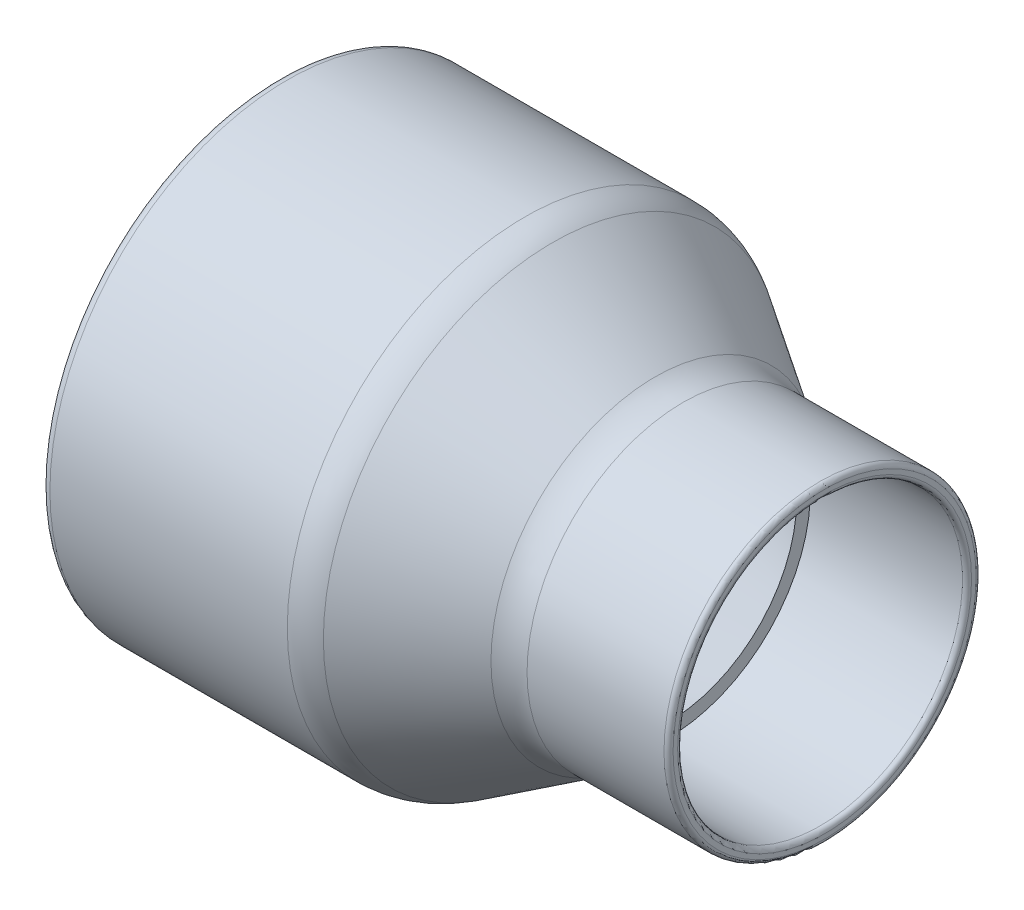
ISO-10303-21;
HEADER;
FILE_DESCRIPTION(('STEP AP214'),'2;1');
FILE_NAME('part.step','',(''),(''),'','','');
FILE_SCHEMA(('AUTOMOTIVE_DESIGN { 1 0 10303 214 1 1 1 1 }'));
ENDSEC;
DATA;
#1=APPLICATION_CONTEXT('core data for automotive mechanical design processes');
#2=APPLICATION_PROTOCOL_DEFINITION('international standard','automotive_design',2000,#1);
#3=PRODUCT_CONTEXT('',#1,'mechanical');
#4=PRODUCT('Part','Part','',(#3));
#5=PRODUCT_RELATED_PRODUCT_CATEGORY('part','',(#4));
#6=PRODUCT_DEFINITION_FORMATION('','',#4);
#7=PRODUCT_DEFINITION_CONTEXT('part definition',#1,'design');
#8=PRODUCT_DEFINITION('design','',#6,#7);
#9=PRODUCT_DEFINITION_SHAPE('','',#8);
#10=(LENGTH_UNIT() NAMED_UNIT(*) SI_UNIT(.MILLI.,.METRE.));
#11=(NAMED_UNIT(*) PLANE_ANGLE_UNIT() SI_UNIT($,.RADIAN.));
#12=(NAMED_UNIT(*) SI_UNIT($,.STERADIAN.) SOLID_ANGLE_UNIT());
#13=UNCERTAINTY_MEASURE_WITH_UNIT(LENGTH_MEASURE(1.E-05),#10,'distance_accuracy_value','');
#14=(GEOMETRIC_REPRESENTATION_CONTEXT(3) GLOBAL_UNCERTAINTY_ASSIGNED_CONTEXT((#13)) GLOBAL_UNIT_ASSIGNED_CONTEXT((#10,
#11,#12)) REPRESENTATION_CONTEXT('',''));
#15=CARTESIAN_POINT('',(0.,0.,0.));
#16=DIRECTION('',(0.,0.,1.));
#17=DIRECTION('',(1.,0.,0.));
#18=AXIS2_PLACEMENT_3D('',#15,#16,#17);
#19=CARTESIAN_POINT('',(30.75,33.9,0.));
#20=DIRECTION('',(-1.,0.,0.));
#21=DIRECTION('',(0.,0.,1.));
#22=AXIS2_PLACEMENT_3D('',#19,#20,#21);
#23=PLANE('',#22);
#24=CARTESIAN_POINT('',(30.75,0.,0.));
#25=DIRECTION('',(-1.,0.,0.));
#26=DIRECTION('',(0.,0.,1.));
#27=AXIS2_PLACEMENT_3D('',#24,#25,#26);
#28=CIRCLE('',#27,37.5);
#29=CARTESIAN_POINT('',(30.75,0.,37.5));
#30=VERTEX_POINT('',#29);
#31=EDGE_CURVE('E10',#30,#30,#28,.T.);
#32=ORIENTED_EDGE('',*,*,#31,.F.);
#33=EDGE_LOOP('',(#32));
#34=FACE_BOUND('',#33,.T.);
#35=CARTESIAN_POINT('',(30.75,0.,0.));
#36=DIRECTION('',(-1.,0.,0.));
#37=DIRECTION('',(0.,0.,1.));
#38=AXIS2_PLACEMENT_3D('',#35,#36,#37);
#39=CIRCLE('',#38,33.9);
#40=CARTESIAN_POINT('',(30.75,0.,33.9));
#41=VERTEX_POINT('',#40);
#42=EDGE_CURVE('E85',#41,#41,#39,.T.);
#43=ORIENTED_EDGE('',*,*,#42,.T.);
#44=EDGE_LOOP('',(#43));
#45=FACE_BOUND('',#44,.T.);
#46=ADVANCED_FACE('F30',(#34,#45),#23,.F.);
#47=CARTESIAN_POINT('',(-72.,0.,0.));
#48=DIRECTION('',(-1.,0.,0.));
#49=DIRECTION('',(0.,0.,1.));
#50=AXIS2_PLACEMENT_3D('',#47,#48,#49);
#51=CYLINDRICAL_SURFACE('',#50,37.5);
#52=CARTESIAN_POINT('',(70.8,0.,0.));
#53=DIRECTION('',(-1.,0.,0.));
#54=DIRECTION('',(0.,0.,1.));
#55=AXIS2_PLACEMENT_3D('',#52,#53,#54);
#56=CIRCLE('',#55,37.5);
#57=CARTESIAN_POINT('',(70.8,0.,37.5));
#58=VERTEX_POINT('',#57);
#59=EDGE_CURVE('E36',#58,#58,#56,.T.);
#60=ORIENTED_EDGE('',*,*,#59,.F.);
#61=EDGE_LOOP('',(#60));
#62=FACE_BOUND('',#61,.T.);
#63=ORIENTED_EDGE('',*,*,#31,.T.);
#64=EDGE_LOOP('',(#63));
#65=FACE_BOUND('',#64,.T.);
#66=ADVANCED_FACE('F176',(#62,#65),#51,.F.);
#67=CARTESIAN_POINT('',(70.8,0.,0.));
#68=DIRECTION('',(-1.,0.,0.));
#69=DIRECTION('',(0.,0.,1.));
#70=AXIS2_PLACEMENT_3D('',#67,#68,#69);
#71=TOROIDAL_SURFACE('',#70,38.7,1.20000000000001);
#72=CARTESIAN_POINT('',(72.,0.,0.));
#73=DIRECTION('',(-1.,0.,0.));
#74=DIRECTION('',(0.,0.,1.));
#75=AXIS2_PLACEMENT_3D('',#72,#73,#74);
#76=CIRCLE('',#75,38.7);
#77=CARTESIAN_POINT('',(72.,0.,38.7));
#78=VERTEX_POINT('',#77);
#79=EDGE_CURVE('E40',#78,#78,#76,.T.);
#80=ORIENTED_EDGE('',*,*,#79,.F.);
#81=EDGE_LOOP('',(#80));
#82=FACE_BOUND('',#81,.T.);
#83=ORIENTED_EDGE('',*,*,#59,.T.);
#84=EDGE_LOOP('',(#83));
#85=FACE_BOUND('',#84,.T.);
#86=ADVANCED_FACE('F171',(#82,#85),#71,.T.);
#87=CARTESIAN_POINT('',(72.,38.7,0.));
#88=DIRECTION('',(-1.,0.,0.));
#89=DIRECTION('',(0.,0.,1.));
#90=AXIS2_PLACEMENT_3D('',#87,#88,#89);
#91=PLANE('',#90);
#92=CARTESIAN_POINT('',(72.,0.,0.));
#93=DIRECTION('',(-1.,0.,0.));
#94=DIRECTION('',(0.,0.,1.));
#95=AXIS2_PLACEMENT_3D('',#92,#93,#94);
#96=CIRCLE('',#95,39.9);
#97=CARTESIAN_POINT('',(72.,0.,39.9));
#98=VERTEX_POINT('',#97);
#99=EDGE_CURVE('E44',#98,#98,#96,.T.);
#100=ORIENTED_EDGE('',*,*,#99,.F.);
#101=EDGE_LOOP('',(#100));
#102=FACE_BOUND('',#101,.T.);
#103=ORIENTED_EDGE('',*,*,#79,.T.);
#104=EDGE_LOOP('',(#103));
#105=FACE_BOUND('',#104,.T.);
#106=ADVANCED_FACE('F165',(#102,#105),#91,.F.);
#107=CARTESIAN_POINT('',(70.8,0.,0.));
#108=DIRECTION('',(-1.,0.,0.));
#109=DIRECTION('',(0.,0.,1.));
#110=AXIS2_PLACEMENT_3D('',#107,#108,#109);
#111=TOROIDAL_SURFACE('',#110,39.9,1.20000000000002);
#112=CARTESIAN_POINT('',(70.8,0.,0.));
#113=DIRECTION('',(-1.,0.,0.));
#114=DIRECTION('',(0.,0.,1.));
#115=AXIS2_PLACEMENT_3D('',#112,#113,#114);
#116=CIRCLE('',#115,41.1);
#117=CARTESIAN_POINT('',(70.8,0.,41.1));
#118=VERTEX_POINT('',#117);
#119=EDGE_CURVE('E49',#118,#118,#116,.T.);
#120=ORIENTED_EDGE('',*,*,#119,.F.);
#121=EDGE_LOOP('',(#120));
#122=FACE_BOUND('',#121,.T.);
#123=ORIENTED_EDGE('',*,*,#99,.T.);
#124=EDGE_LOOP('',(#123));
#125=FACE_BOUND('',#124,.T.);
#126=ADVANCED_FACE('F159',(#122,#125),#111,.T.);
#127=CARTESIAN_POINT('',(-72.,0.,0.));
#128=DIRECTION('',(-1.,0.,0.));
#129=DIRECTION('',(0.,0.,1.));
#130=AXIS2_PLACEMENT_3D('',#127,#128,#129);
#131=CYLINDRICAL_SURFACE('',#130,41.1);
#132=CARTESIAN_POINT('',(34.7418459756254,0.,0.));
#133=DIRECTION('',(-1.,0.,0.));
#134=DIRECTION('',(0.,0.,1.));
#135=AXIS2_PLACEMENT_3D('',#132,#133,#134);
#136=CIRCLE('',#135,41.1);
#137=CARTESIAN_POINT('',(34.7418459756254,0.,41.1));
#138=VERTEX_POINT('',#137);
#139=EDGE_CURVE('E52',#138,#138,#136,.T.);
#140=ORIENTED_EDGE('',*,*,#139,.F.);
#141=EDGE_LOOP('',(#140));
#142=FACE_BOUND('',#141,.T.);
#143=ORIENTED_EDGE('',*,*,#119,.T.);
#144=EDGE_LOOP('',(#143));
#145=FACE_BOUND('',#144,.T.);
#146=ADVANCED_FACE('F153',(#142,#145),#131,.T.);
#147=CARTESIAN_POINT('',(34.7418459756254,0.,0.));
#148=DIRECTION('',(-1.,0.,0.));
#149=DIRECTION('',(0.,0.,1.));
#150=AXIS2_PLACEMENT_3D('',#147,#148,#149);
#151=TOROIDAL_SURFACE('',#150,54.85,13.75);
#152=CARTESIAN_POINT('',(27.3787416467901,0.,0.));
#153=DIRECTION('',(-1.,0.,0.));
#154=DIRECTION('',(0.,0.,1.));
#155=AXIS2_PLACEMENT_3D('',#152,#153,#154);
#156=CIRCLE('',#155,43.2376275187761);
#157=CARTESIAN_POINT('',(27.3787416467901,0.,43.2376275187761));
#158=VERTEX_POINT('',#157);
#159=EDGE_CURVE('E55',#158,#158,#156,.T.);
#160=ORIENTED_EDGE('',*,*,#159,.F.);
#161=EDGE_LOOP('',(#160));
#162=FACE_BOUND('',#161,.T.);
#163=ORIENTED_EDGE('',*,*,#139,.T.);
#164=EDGE_LOOP('',(#163));
#165=FACE_BOUND('',#164,.T.);
#166=ADVANCED_FACE('F147',(#162,#165),#151,.F.);
#167=CARTESIAN_POINT('',(27.3787416467901,0.,0.));
#168=DIRECTION('',(-1.,0.,0.));
#169=DIRECTION('',(0.,0.,1.));
#170=AXIS2_PLACEMENT_3D('',#167,#168,#169);
#171=CONICAL_SURFACE('',#170,43.2376275187761,0.56509789760029);
#172=CARTESIAN_POINT('',(0.371258353209933,0.,0.));
#173=DIRECTION('',(-1.,0.,0.));
#174=DIRECTION('',(0.,0.,1.));
#175=AXIS2_PLACEMENT_3D('',#172,#173,#174);
#176=CIRCLE('',#175,60.3623724812239);
#177=CARTESIAN_POINT('',(0.371258353209933,0.,60.3623724812239));
#178=VERTEX_POINT('',#177);
#179=EDGE_CURVE('E58',#178,#178,#176,.T.);
#180=ORIENTED_EDGE('',*,*,#179,.F.);
#181=EDGE_LOOP('',(#180));
#182=FACE_BOUND('',#181,.T.);
#183=ORIENTED_EDGE('',*,*,#159,.T.);
#184=EDGE_LOOP('',(#183));
#185=FACE_BOUND('',#184,.T.);
#186=ADVANCED_FACE('F141',(#182,#185),#171,.T.);
#187=CARTESIAN_POINT('',(-6.99184597562538,0.,0.));
#188=DIRECTION('',(-1.,0.,0.));
#189=DIRECTION('',(0.,0.,1.));
#190=AXIS2_PLACEMENT_3D('',#187,#188,#189);
#191=TOROIDAL_SURFACE('',#190,48.75,13.75);
#192=CARTESIAN_POINT('',(-6.99184597562538,0.,0.));
#193=DIRECTION('',(-1.,0.,0.));
#194=DIRECTION('',(0.,0.,1.));
#195=AXIS2_PLACEMENT_3D('',#192,#193,#194);
#196=CIRCLE('',#195,62.5);
#197=CARTESIAN_POINT('',(-6.99184597562538,0.,62.5));
#198=VERTEX_POINT('',#197);
#199=EDGE_CURVE('E61',#198,#198,#196,.T.);
#200=ORIENTED_EDGE('',*,*,#199,.F.);
#201=EDGE_LOOP('',(#200));
#202=FACE_BOUND('',#201,.T.);
#203=ORIENTED_EDGE('',*,*,#179,.T.);
#204=EDGE_LOOP('',(#203));
#205=FACE_BOUND('',#204,.T.);
#206=ADVANCED_FACE('F135',(#202,#205),#191,.T.);
#207=CARTESIAN_POINT('',(-72.,0.,0.));
#208=DIRECTION('',(-1.,0.,0.));
#209=DIRECTION('',(0.,0.,1.));
#210=AXIS2_PLACEMENT_3D('',#207,#208,#209);
#211=CYLINDRICAL_SURFACE('',#210,62.5);
#212=CARTESIAN_POINT('',(-69.5,0.,0.));
#213=DIRECTION('',(-1.,0.,0.));
#214=DIRECTION('',(0.,0.,1.));
#215=AXIS2_PLACEMENT_3D('',#212,#213,#214);
#216=CIRCLE('',#215,62.5);
#217=CARTESIAN_POINT('',(-69.5,0.,62.5));
#218=VERTEX_POINT('',#217);
#219=EDGE_CURVE('E64',#218,#218,#216,.T.);
#220=ORIENTED_EDGE('',*,*,#219,.F.);
#221=EDGE_LOOP('',(#220));
#222=FACE_BOUND('',#221,.T.);
#223=ORIENTED_EDGE('',*,*,#199,.T.);
#224=EDGE_LOOP('',(#223));
#225=FACE_BOUND('',#224,.T.);
#226=ADVANCED_FACE('F129',(#222,#225),#211,.T.);
#227=CARTESIAN_POINT('',(-69.5,0.,0.));
#228=DIRECTION('',(-1.,0.,0.));
#229=DIRECTION('',(0.,0.,1.));
#230=AXIS2_PLACEMENT_3D('',#227,#228,#229);
#231=TOROIDAL_SURFACE('',#230,60.,2.5);
#232=CARTESIAN_POINT('',(-72.,0.,0.));
#233=DIRECTION('',(-1.,0.,0.));
#234=DIRECTION('',(0.,0.,1.));
#235=AXIS2_PLACEMENT_3D('',#232,#233,#234);
#236=CIRCLE('',#235,60.);
#237=CARTESIAN_POINT('',(-72.,0.,60.));
#238=VERTEX_POINT('',#237);
#239=EDGE_CURVE('E67',#238,#238,#236,.T.);
#240=ORIENTED_EDGE('',*,*,#239,.F.);
#241=EDGE_LOOP('',(#240));
#242=FACE_BOUND('',#241,.T.);
#243=ORIENTED_EDGE('',*,*,#219,.T.);
#244=EDGE_LOOP('',(#243));
#245=FACE_BOUND('',#244,.T.);
#246=ADVANCED_FACE('F123',(#242,#245),#231,.T.);
#247=CARTESIAN_POINT('',(-72.,60.,0.));
#248=DIRECTION('',(1.,0.,0.));
#249=DIRECTION('',(0.,0.,-1.));
#250=AXIS2_PLACEMENT_3D('',#247,#248,#249);
#251=PLANE('',#250);
#252=CARTESIAN_POINT('',(-72.,0.,0.));
#253=DIRECTION('',(-1.,0.,0.));
#254=DIRECTION('',(0.,0.,1.));
#255=AXIS2_PLACEMENT_3D('',#252,#253,#254);
#256=CIRCLE('',#255,57.5);
#257=CARTESIAN_POINT('',(-72.,0.,57.5));
#258=VERTEX_POINT('',#257);
#259=EDGE_CURVE('E70',#258,#258,#256,.T.);
#260=ORIENTED_EDGE('',*,*,#259,.F.);
#261=EDGE_LOOP('',(#260));
#262=FACE_BOUND('',#261,.T.);
#263=ORIENTED_EDGE('',*,*,#239,.T.);
#264=EDGE_LOOP('',(#263));
#265=FACE_BOUND('',#264,.T.);
#266=ADVANCED_FACE('F117',(#262,#265),#251,.F.);
#267=CARTESIAN_POINT('',(-69.5,0.,0.));
#268=DIRECTION('',(-1.,0.,0.));
#269=DIRECTION('',(0.,0.,1.));
#270=AXIS2_PLACEMENT_3D('',#267,#268,#269);
#271=TOROIDAL_SURFACE('',#270,57.5,2.5);
#272=CARTESIAN_POINT('',(-69.5,0.,0.));
#273=DIRECTION('',(-1.,0.,0.));
#274=DIRECTION('',(0.,0.,1.));
#275=AXIS2_PLACEMENT_3D('',#272,#273,#274);
#276=CIRCLE('',#275,55.);
#277=CARTESIAN_POINT('',(-69.5,0.,55.));
#278=VERTEX_POINT('',#277);
#279=EDGE_CURVE('E73',#278,#278,#276,.T.);
#280=ORIENTED_EDGE('',*,*,#279,.F.);
#281=EDGE_LOOP('',(#280));
#282=FACE_BOUND('',#281,.T.);
#283=ORIENTED_EDGE('',*,*,#259,.T.);
#284=EDGE_LOOP('',(#283));
#285=FACE_BOUND('',#284,.T.);
#286=ADVANCED_FACE('F111',(#282,#285),#271,.T.);
#287=CARTESIAN_POINT('',(-72.,0.,0.));
#288=DIRECTION('',(-1.,0.,0.));
#289=DIRECTION('',(0.,0.,1.));
#290=AXIS2_PLACEMENT_3D('',#287,#288,#289);
#291=CYLINDRICAL_SURFACE('',#290,55.);
#292=CARTESIAN_POINT('',(-4.2,0.,0.));
#293=DIRECTION('',(-1.,0.,0.));
#294=DIRECTION('',(0.,0.,1.));
#295=AXIS2_PLACEMENT_3D('',#292,#293,#294);
#296=CIRCLE('',#295,55.);
#297=CARTESIAN_POINT('',(-4.2,0.,55.));
#298=VERTEX_POINT('',#297);
#299=EDGE_CURVE('E76',#298,#298,#296,.T.);
#300=ORIENTED_EDGE('',*,*,#299,.F.);
#301=EDGE_LOOP('',(#300));
#302=FACE_BOUND('',#301,.T.);
#303=ORIENTED_EDGE('',*,*,#279,.T.);
#304=EDGE_LOOP('',(#303));
#305=FACE_BOUND('',#304,.T.);
#306=ADVANCED_FACE('F105',(#302,#305),#291,.F.);
#307=CARTESIAN_POINT('',(-4.2,0.,0.));
#308=DIRECTION('',(-1.,0.,0.));
#309=DIRECTION('',(0.,0.,1.));
#310=AXIS2_PLACEMENT_3D('',#307,#308,#309);
#311=TOROIDAL_SURFACE('',#310,53.8,1.2);
#312=CARTESIAN_POINT('',(-3.,0.,0.));
#313=DIRECTION('',(-1.,0.,0.));
#314=DIRECTION('',(0.,0.,1.));
#315=AXIS2_PLACEMENT_3D('',#312,#313,#314);
#316=CIRCLE('',#315,53.8);
#317=CARTESIAN_POINT('',(-3.,0.,53.8));
#318=VERTEX_POINT('',#317);
#319=EDGE_CURVE('E79',#318,#318,#316,.T.);
#320=ORIENTED_EDGE('',*,*,#319,.F.);
#321=EDGE_LOOP('',(#320));
#322=FACE_BOUND('',#321,.T.);
#323=ORIENTED_EDGE('',*,*,#299,.T.);
#324=EDGE_LOOP('',(#323));
#325=FACE_BOUND('',#324,.T.);
#326=ADVANCED_FACE('F99',(#322,#325),#311,.F.);
#327=CARTESIAN_POINT('',(-3.,51.4,0.));
#328=DIRECTION('',(1.,0.,0.));
#329=DIRECTION('',(0.,0.,-1.));
#330=AXIS2_PLACEMENT_3D('',#327,#328,#329);
#331=PLANE('',#330);
#332=CARTESIAN_POINT('',(-3.,0.,0.));
#333=DIRECTION('',(-1.,0.,0.));
#334=DIRECTION('',(0.,0.,1.));
#335=AXIS2_PLACEMENT_3D('',#332,#333,#334);
#336=CIRCLE('',#335,51.4);
#337=CARTESIAN_POINT('',(-3.,0.,51.4));
#338=VERTEX_POINT('',#337);
#339=EDGE_CURVE('E82',#338,#338,#336,.T.);
#340=ORIENTED_EDGE('',*,*,#339,.F.);
#341=EDGE_LOOP('',(#340));
#342=FACE_BOUND('',#341,.T.);
#343=ORIENTED_EDGE('',*,*,#319,.T.);
#344=EDGE_LOOP('',(#343));
#345=FACE_BOUND('',#344,.T.);
#346=ADVANCED_FACE('F93',(#342,#345),#331,.F.);
#347=CARTESIAN_POINT('',(-3.,0.,0.));
#348=DIRECTION('',(-1.,0.,0.));
#349=DIRECTION('',(0.,0.,1.));
#350=AXIS2_PLACEMENT_3D('',#347,#348,#349);
#351=CONICAL_SURFACE('',#350,51.4,0.478352431378657);
#352=ORIENTED_EDGE('',*,*,#42,.F.);
#353=EDGE_LOOP('',(#352));
#354=FACE_BOUND('',#353,.T.);
#355=ORIENTED_EDGE('',*,*,#339,.T.);
#356=EDGE_LOOP('',(#355));
#357=FACE_BOUND('',#356,.T.);
#358=ADVANCED_FACE('F90',(#354,#357),#351,.F.);
#359=CLOSED_SHELL('',(#46,#66,#86,#106,#126,#146,#166,#186,#206,#226,#246,#266,#286,#306,#326,
#346,#358));
#360=MANIFOLD_SOLID_BREP('B2',#359);
#361=ADVANCED_BREP_SHAPE_REPRESENTATION('',(#18,#360),#14);
#362=SHAPE_DEFINITION_REPRESENTATION(#9,#361);
ENDSEC;
END-ISO-10303-21;
